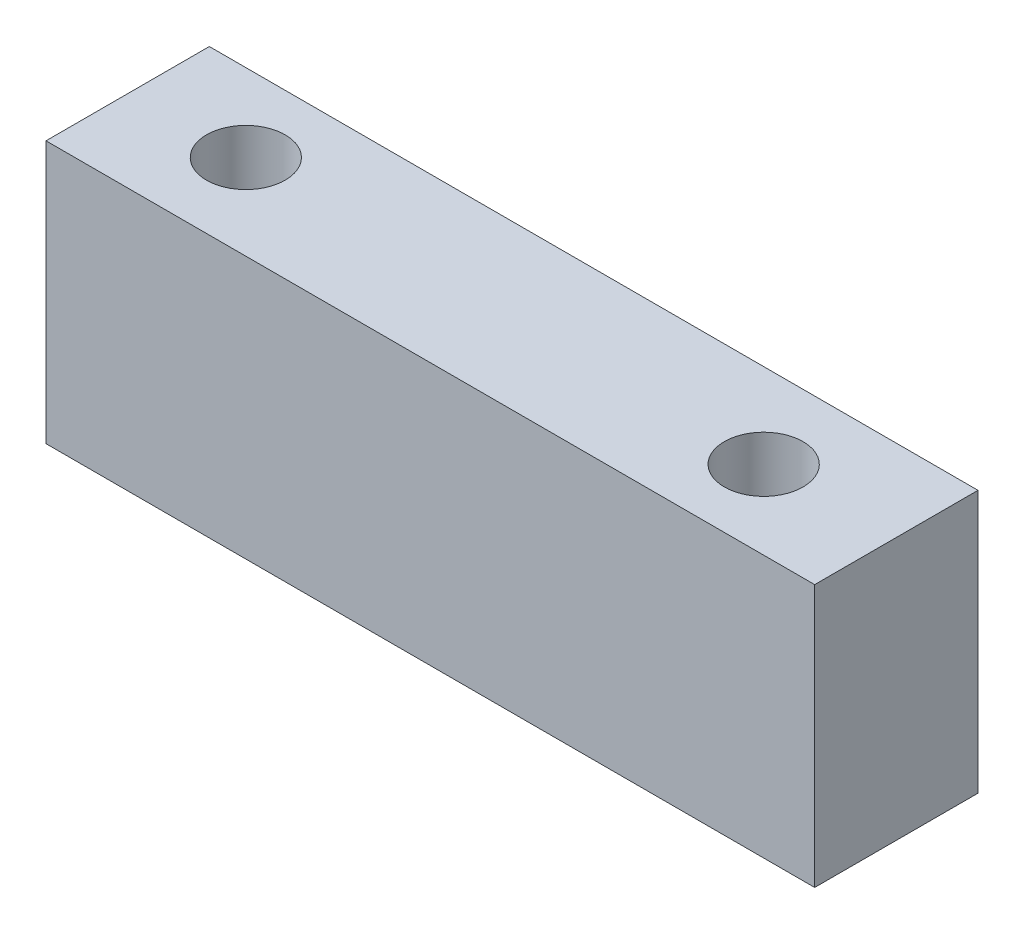
ISO-10303-21;
HEADER;
FILE_DESCRIPTION(('STEP AP214'),'2;1');
FILE_NAME('part.step','',(''),(''),'','','');
FILE_SCHEMA(('AUTOMOTIVE_DESIGN { 1 0 10303 214 1 1 1 1 }'));
ENDSEC;
DATA;
#1=APPLICATION_CONTEXT('core data for automotive mechanical design processes');
#2=APPLICATION_PROTOCOL_DEFINITION('international standard','automotive_design',2000,#1);
#3=PRODUCT_CONTEXT('',#1,'mechanical');
#4=PRODUCT('Part','Part','',(#3));
#5=PRODUCT_RELATED_PRODUCT_CATEGORY('part','',(#4));
#6=PRODUCT_DEFINITION_FORMATION('','',#4);
#7=PRODUCT_DEFINITION_CONTEXT('part definition',#1,'design');
#8=PRODUCT_DEFINITION('design','',#6,#7);
#9=PRODUCT_DEFINITION_SHAPE('','',#8);
#10=(LENGTH_UNIT() NAMED_UNIT(*) SI_UNIT(.MILLI.,.METRE.));
#11=(NAMED_UNIT(*) PLANE_ANGLE_UNIT() SI_UNIT($,.RADIAN.));
#12=(NAMED_UNIT(*) SI_UNIT($,.STERADIAN.) SOLID_ANGLE_UNIT());
#13=UNCERTAINTY_MEASURE_WITH_UNIT(LENGTH_MEASURE(1.E-05),#10,'distance_accuracy_value','');
#14=(GEOMETRIC_REPRESENTATION_CONTEXT(3) GLOBAL_UNCERTAINTY_ASSIGNED_CONTEXT((#13)) GLOBAL_UNIT_ASSIGNED_CONTEXT((#10,
#11,#12)) REPRESENTATION_CONTEXT('',''));
#15=CARTESIAN_POINT('',(0.,0.,0.));
#16=DIRECTION('',(0.,0.,1.));
#17=DIRECTION('',(1.,0.,0.));
#18=AXIS2_PLACEMENT_3D('',#15,#16,#17);
#19=CARTESIAN_POINT('',(0.,10.,0.));
#20=DIRECTION('',(0.,1.,0.));
#21=DIRECTION('',(0.,0.,1.));
#22=AXIS2_PLACEMENT_3D('',#19,#20,#21);
#23=PLANE('',#22);
#24=CARTESIAN_POINT('',(-20.4272826110829,10.,-1.51129312487783));
#25=DIRECTION('',(0.,1.,0.));
#26=DIRECTION('',(0.,0.,1.));
#27=AXIS2_PLACEMENT_3D('',#24,#25,#26);
#28=CIRCLE('',#27,1.5);
#29=CARTESIAN_POINT('',(-20.4272826110829,10.,-0.0112931248778339));
#30=VERTEX_POINT('',#29);
#31=EDGE_CURVE('E118',#30,#30,#28,.T.);
#32=ORIENTED_EDGE('',*,*,#31,.F.);
#33=EDGE_LOOP('',(#32));
#34=FACE_BOUND('',#33,.T.);
#35=DIRECTION('',(0.,0.,-1.));
#36=VECTOR('',#35,1.);
#37=CARTESIAN_POINT('',(4.51698760287634,10.,-4.47968515270244));
#38=LINE('',#37,#36);
#39=CARTESIAN_POINT('',(4.51698760287634,10.,1.7464328945055));
#40=VERTEX_POINT('',#39);
#41=CARTESIAN_POINT('',(4.51698760287634,10.,-4.47968515270244));
#42=VERTEX_POINT('',#41);
#43=EDGE_CURVE('E98',#40,#42,#38,.T.);
#44=ORIENTED_EDGE('',*,*,#43,.T.);
#45=DIRECTION('',(-1.,0.,0.));
#46=VECTOR('',#45,1.);
#47=CARTESIAN_POINT('',(-24.787274672649,10.,-4.47968515270244));
#48=LINE('',#47,#46);
#49=CARTESIAN_POINT('',(-24.787274672649,10.,-4.47968515270244));
#50=VERTEX_POINT('',#49);
#51=EDGE_CURVE('E93',#42,#50,#48,.T.);
#52=ORIENTED_EDGE('',*,*,#51,.T.);
#53=DIRECTION('',(0.,0.,1.));
#54=VECTOR('',#53,1.);
#55=CARTESIAN_POINT('',(-24.787274672649,10.,-4.47968515270244));
#56=LINE('',#55,#54);
#57=CARTESIAN_POINT('',(-24.787274672649,10.,1.7464328945055));
#58=VERTEX_POINT('',#57);
#59=EDGE_CURVE('E96',#50,#58,#56,.T.);
#60=ORIENTED_EDGE('',*,*,#59,.T.);
#61=DIRECTION('',(1.,0.,0.));
#62=VECTOR('',#61,1.);
#63=CARTESIAN_POINT('',(-24.787274672649,10.,1.7464328945055));
#64=LINE('',#63,#62);
#65=EDGE_CURVE('E63',#58,#40,#64,.T.);
#66=ORIENTED_EDGE('',*,*,#65,.T.);
#67=EDGE_LOOP('',(#44,#52,#60,#66));
#68=FACE_BOUND('',#67,.T.);
#69=CARTESIAN_POINT('',(-0.427282611082897,10.,-1.2535671054945));
#70=DIRECTION('',(0.,1.,0.));
#71=DIRECTION('',(0.,0.,1.));
#72=AXIS2_PLACEMENT_3D('',#69,#70,#71);
#73=CIRCLE('',#72,1.5);
#74=CARTESIAN_POINT('',(-0.427282611082897,10.,0.246432894505496));
#75=VERTEX_POINT('',#74);
#76=EDGE_CURVE('E140',#75,#75,#73,.T.);
#77=ORIENTED_EDGE('',*,*,#76,.F.);
#78=EDGE_LOOP('',(#77));
#79=FACE_BOUND('',#78,.T.);
#80=ADVANCED_FACE('F45',(#34,#68,#79),#23,.T.);
#81=CARTESIAN_POINT('',(0.,0.,0.));
#82=DIRECTION('',(0.,1.,0.));
#83=DIRECTION('',(0.,0.,1.));
#84=AXIS2_PLACEMENT_3D('',#81,#82,#83);
#85=PLANE('',#84);
#86=DIRECTION('',(0.,0.,-1.));
#87=VECTOR('',#86,1.);
#88=CARTESIAN_POINT('',(4.51698760287634,0.,-4.47968515270244));
#89=LINE('',#88,#87);
#90=CARTESIAN_POINT('',(4.51698760287634,0.,1.7464328945055));
#91=VERTEX_POINT('',#90);
#92=CARTESIAN_POINT('',(4.51698760287634,0.,-4.47968515270244));
#93=VERTEX_POINT('',#92);
#94=EDGE_CURVE('E114',#91,#93,#89,.T.);
#95=ORIENTED_EDGE('',*,*,#94,.F.);
#96=DIRECTION('',(1.,0.,0.));
#97=VECTOR('',#96,1.);
#98=CARTESIAN_POINT('',(-24.787274672649,0.,1.7464328945055));
#99=LINE('',#98,#97);
#100=CARTESIAN_POINT('',(-24.787274672649,0.,1.7464328945055));
#101=VERTEX_POINT('',#100);
#102=EDGE_CURVE('E86',#101,#91,#99,.T.);
#103=ORIENTED_EDGE('',*,*,#102,.F.);
#104=DIRECTION('',(0.,0.,1.));
#105=VECTOR('',#104,1.);
#106=CARTESIAN_POINT('',(-24.787274672649,0.,-4.47968515270244));
#107=LINE('',#106,#105);
#108=CARTESIAN_POINT('',(-24.787274672649,0.,-4.47968515270244));
#109=VERTEX_POINT('',#108);
#110=EDGE_CURVE('E80',#109,#101,#107,.T.);
#111=ORIENTED_EDGE('',*,*,#110,.F.);
#112=DIRECTION('',(-1.,0.,0.));
#113=VECTOR('',#112,1.);
#114=CARTESIAN_POINT('',(-24.787274672649,0.,-4.47968515270244));
#115=LINE('',#114,#113);
#116=EDGE_CURVE('E103',#93,#109,#115,.T.);
#117=ORIENTED_EDGE('',*,*,#116,.F.);
#118=EDGE_LOOP('',(#95,#103,#111,#117));
#119=FACE_BOUND('',#118,.T.);
#120=CARTESIAN_POINT('',(-20.4272826110829,0.,-1.51129312487783));
#121=DIRECTION('',(0.,1.,0.));
#122=DIRECTION('',(0.,0.,1.));
#123=AXIS2_PLACEMENT_3D('',#120,#121,#122);
#124=CIRCLE('',#123,1.5);
#125=CARTESIAN_POINT('',(-20.4272826110829,0.,-0.0112931248778339));
#126=VERTEX_POINT('',#125);
#127=EDGE_CURVE('E136',#126,#126,#124,.T.);
#128=ORIENTED_EDGE('',*,*,#127,.T.);
#129=EDGE_LOOP('',(#128));
#130=FACE_BOUND('',#129,.T.);
#131=CARTESIAN_POINT('',(-0.427282611082897,0.,-1.2535671054945));
#132=DIRECTION('',(0.,1.,0.));
#133=DIRECTION('',(0.,0.,1.));
#134=AXIS2_PLACEMENT_3D('',#131,#132,#133);
#135=CIRCLE('',#134,1.5);
#136=CARTESIAN_POINT('',(-0.427282611082897,0.,0.246432894505496));
#137=VERTEX_POINT('',#136);
#138=EDGE_CURVE('E144',#137,#137,#135,.T.);
#139=ORIENTED_EDGE('',*,*,#138,.T.);
#140=EDGE_LOOP('',(#139));
#141=FACE_BOUND('',#140,.T.);
#142=ADVANCED_FACE('F131',(#119,#130,#141),#85,.F.);
#143=CARTESIAN_POINT('',(4.51698760287634,10.,-4.47968515270244));
#144=DIRECTION('',(-1.,0.,0.));
#145=DIRECTION('',(0.,0.,1.));
#146=AXIS2_PLACEMENT_3D('',#143,#144,#145);
#147=PLANE('',#146);
#148=ORIENTED_EDGE('',*,*,#94,.T.);
#149=DIRECTION('',(0.,-1.,0.));
#150=VECTOR('',#149,1.);
#151=CARTESIAN_POINT('',(4.51698760287634,10.,-4.47968515270244));
#152=LINE('',#151,#150);
#153=EDGE_CURVE('E11',#42,#93,#152,.T.);
#154=ORIENTED_EDGE('',*,*,#153,.F.);
#155=ORIENTED_EDGE('',*,*,#43,.F.);
#156=DIRECTION('',(0.,-1.,0.));
#157=VECTOR('',#156,1.);
#158=CARTESIAN_POINT('',(4.51698760287634,10.,1.7464328945055));
#159=LINE('',#158,#157);
#160=EDGE_CURVE('E110',#40,#91,#159,.T.);
#161=ORIENTED_EDGE('',*,*,#160,.T.);
#162=EDGE_LOOP('',(#148,#154,#155,#161));
#163=FACE_BOUND('',#162,.T.);
#164=ADVANCED_FACE('F47',(#163),#147,.F.);
#165=CARTESIAN_POINT('',(-24.787274672649,10.,-4.47968515270244));
#166=DIRECTION('',(0.,0.,1.));
#167=DIRECTION('',(1.,0.,0.));
#168=AXIS2_PLACEMENT_3D('',#165,#166,#167);
#169=PLANE('',#168);
#170=ORIENTED_EDGE('',*,*,#116,.T.);
#171=DIRECTION('',(0.,-1.,0.));
#172=VECTOR('',#171,1.);
#173=CARTESIAN_POINT('',(-24.787274672649,10.,-4.47968515270244));
#174=LINE('',#173,#172);
#175=EDGE_CURVE('E55',#50,#109,#174,.T.);
#176=ORIENTED_EDGE('',*,*,#175,.F.);
#177=ORIENTED_EDGE('',*,*,#51,.F.);
#178=ORIENTED_EDGE('',*,*,#153,.T.);
#179=EDGE_LOOP('',(#170,#176,#177,#178));
#180=FACE_BOUND('',#179,.T.);
#181=ADVANCED_FACE('F102',(#180),#169,.F.);
#182=CARTESIAN_POINT('',(-24.787274672649,10.,-4.47968515270244));
#183=DIRECTION('',(1.,0.,0.));
#184=DIRECTION('',(0.,0.,-1.));
#185=AXIS2_PLACEMENT_3D('',#182,#183,#184);
#186=PLANE('',#185);
#187=ORIENTED_EDGE('',*,*,#110,.T.);
#188=DIRECTION('',(0.,-1.,0.));
#189=VECTOR('',#188,1.);
#190=CARTESIAN_POINT('',(-24.787274672649,10.,1.7464328945055));
#191=LINE('',#190,#189);
#192=EDGE_CURVE('E105',#58,#101,#191,.T.);
#193=ORIENTED_EDGE('',*,*,#192,.F.);
#194=ORIENTED_EDGE('',*,*,#59,.F.);
#195=ORIENTED_EDGE('',*,*,#175,.T.);
#196=EDGE_LOOP('',(#187,#193,#194,#195));
#197=FACE_BOUND('',#196,.T.);
#198=ADVANCED_FACE('F106',(#197),#186,.F.);
#199=CARTESIAN_POINT('',(-24.787274672649,10.,1.7464328945055));
#200=DIRECTION('',(0.,0.,-1.));
#201=DIRECTION('',(-1.,0.,0.));
#202=AXIS2_PLACEMENT_3D('',#199,#200,#201);
#203=PLANE('',#202);
#204=ORIENTED_EDGE('',*,*,#102,.T.);
#205=ORIENTED_EDGE('',*,*,#160,.F.);
#206=ORIENTED_EDGE('',*,*,#65,.F.);
#207=ORIENTED_EDGE('',*,*,#192,.T.);
#208=EDGE_LOOP('',(#204,#205,#206,#207));
#209=FACE_BOUND('',#208,.T.);
#210=ADVANCED_FACE('F128',(#209),#203,.F.);
#211=CARTESIAN_POINT('',(-20.4272826110829,10.,-1.51129312487783));
#212=DIRECTION('',(0.,-1.,0.));
#213=DIRECTION('',(0.,0.,-1.));
#214=AXIS2_PLACEMENT_3D('',#211,#212,#213);
#215=CYLINDRICAL_SURFACE('',#214,1.5);
#216=ORIENTED_EDGE('',*,*,#31,.T.);
#217=EDGE_LOOP('',(#216));
#218=FACE_BOUND('',#217,.T.);
#219=ORIENTED_EDGE('',*,*,#127,.F.);
#220=EDGE_LOOP('',(#219));
#221=FACE_BOUND('',#220,.T.);
#222=ADVANCED_FACE('F163',(#218,#221),#215,.F.);
#223=CARTESIAN_POINT('',(-0.427282611082897,10.,-1.2535671054945));
#224=DIRECTION('',(0.,-1.,0.));
#225=DIRECTION('',(0.,0.,-1.));
#226=AXIS2_PLACEMENT_3D('',#223,#224,#225);
#227=CYLINDRICAL_SURFACE('',#226,1.5);
#228=ORIENTED_EDGE('',*,*,#76,.T.);
#229=EDGE_LOOP('',(#228));
#230=FACE_BOUND('',#229,.T.);
#231=ORIENTED_EDGE('',*,*,#138,.F.);
#232=EDGE_LOOP('',(#231));
#233=FACE_BOUND('',#232,.T.);
#234=ADVANCED_FACE('F152',(#230,#233),#227,.F.);
#235=CLOSED_SHELL('',(#80,#142,#164,#181,#198,#210,#222,#234));
#236=MANIFOLD_SOLID_BREP('B2',#235);
#237=ADVANCED_BREP_SHAPE_REPRESENTATION('',(#18,#236),#14);
#238=SHAPE_DEFINITION_REPRESENTATION(#9,#237);
ENDSEC;
END-ISO-10303-21;
